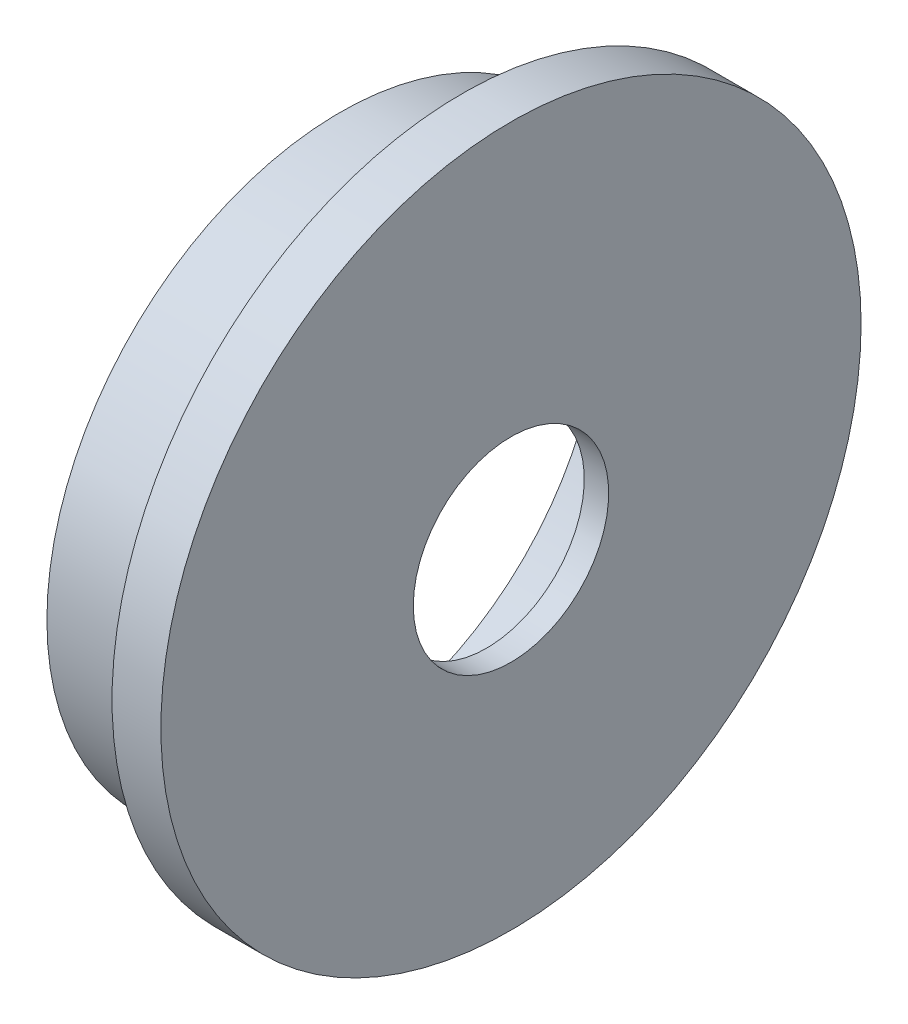
ISO-10303-21;
HEADER;
FILE_DESCRIPTION(('STEP AP214'),'2;1');
FILE_NAME('part.step','',(''),(''),'','','');
FILE_SCHEMA(('AUTOMOTIVE_DESIGN { 1 0 10303 214 1 1 1 1 }'));
ENDSEC;
DATA;
#1=APPLICATION_CONTEXT('core data for automotive mechanical design processes');
#2=APPLICATION_PROTOCOL_DEFINITION('international standard','automotive_design',2000,#1);
#3=PRODUCT_CONTEXT('',#1,'mechanical');
#4=PRODUCT('Part','Part','',(#3));
#5=PRODUCT_RELATED_PRODUCT_CATEGORY('part','',(#4));
#6=PRODUCT_DEFINITION_FORMATION('','',#4);
#7=PRODUCT_DEFINITION_CONTEXT('part definition',#1,'design');
#8=PRODUCT_DEFINITION('design','',#6,#7);
#9=PRODUCT_DEFINITION_SHAPE('','',#8);
#10=(LENGTH_UNIT() NAMED_UNIT(*) SI_UNIT(.MILLI.,.METRE.));
#11=(NAMED_UNIT(*) PLANE_ANGLE_UNIT() SI_UNIT($,.RADIAN.));
#12=(NAMED_UNIT(*) SI_UNIT($,.STERADIAN.) SOLID_ANGLE_UNIT());
#13=UNCERTAINTY_MEASURE_WITH_UNIT(LENGTH_MEASURE(1.E-05),#10,'distance_accuracy_value','');
#14=(GEOMETRIC_REPRESENTATION_CONTEXT(3) GLOBAL_UNCERTAINTY_ASSIGNED_CONTEXT((#13)) GLOBAL_UNIT_ASSIGNED_CONTEXT((#10,
#11,#12)) REPRESENTATION_CONTEXT('',''));
#15=CARTESIAN_POINT('',(0.,0.,0.));
#16=DIRECTION('',(0.,0.,1.));
#17=DIRECTION('',(1.,0.,0.));
#18=AXIS2_PLACEMENT_3D('',#15,#16,#17);
#19=CARTESIAN_POINT('',(-25.9218708534063,0.,0.));
#20=DIRECTION('',(-1.,0.,0.));
#21=DIRECTION('',(0.,0.,1.));
#22=AXIS2_PLACEMENT_3D('',#19,#20,#21);
#23=CYLINDRICAL_SURFACE('',#22,34.);
#24=CARTESIAN_POINT('',(-10.,0.,0.));
#25=DIRECTION('',(-1.,0.,0.));
#26=DIRECTION('',(0.,0.,1.));
#27=AXIS2_PLACEMENT_3D('',#24,#25,#26);
#28=CIRCLE('',#27,34.);
#29=CARTESIAN_POINT('',(-10.,0.,34.));
#30=VERTEX_POINT('',#29);
#31=EDGE_CURVE('E388',#30,#30,#28,.T.);
#32=ORIENTED_EDGE('',*,*,#31,.F.);
#33=EDGE_LOOP('',(#32));
#34=FACE_BOUND('',#33,.T.);
#35=CARTESIAN_POINT('',(-6.,0.,0.));
#36=DIRECTION('',(1.,0.,0.));
#37=DIRECTION('',(0.,0.,-1.));
#38=AXIS2_PLACEMENT_3D('',#35,#36,#37);
#39=CIRCLE('',#38,34.);
#40=CARTESIAN_POINT('',(-6.,0.,-34.));
#41=VERTEX_POINT('',#40);
#42=EDGE_CURVE('E10',#41,#41,#39,.T.);
#43=ORIENTED_EDGE('',*,*,#42,.F.);
#44=EDGE_LOOP('',(#43));
#45=FACE_BOUND('',#44,.T.);
#46=ADVANCED_FACE('F346',(#34,#45),#23,.T.);
#47=CARTESIAN_POINT('',(-25.9218708534063,0.,0.));
#48=DIRECTION('',(-1.,0.,0.));
#49=DIRECTION('',(0.,0.,1.));
#50=AXIS2_PLACEMENT_3D('',#47,#48,#49);
#51=CYLINDRICAL_SURFACE('',#50,28.);
#52=CARTESIAN_POINT('',(-12.,0.,0.));
#53=DIRECTION('',(-1.,0.,0.));
#54=DIRECTION('',(0.,0.,1.));
#55=AXIS2_PLACEMENT_3D('',#52,#53,#54);
#56=CIRCLE('',#55,28.);
#57=CARTESIAN_POINT('',(-12.,0.,28.));
#58=VERTEX_POINT('',#57);
#59=EDGE_CURVE('E373',#58,#58,#56,.T.);
#60=ORIENTED_EDGE('',*,*,#59,.T.);
#61=EDGE_LOOP('',(#60));
#62=FACE_BOUND('',#61,.T.);
#63=CARTESIAN_POINT('',(-6.,0.,0.));
#64=DIRECTION('',(1.,0.,0.));
#65=DIRECTION('',(0.,0.,-1.));
#66=AXIS2_PLACEMENT_3D('',#63,#64,#65);
#67=CIRCLE('',#66,28.);
#68=CARTESIAN_POINT('',(-6.,0.,-28.));
#69=VERTEX_POINT('',#68);
#70=EDGE_CURVE('E354',#69,#69,#67,.F.);
#71=ORIENTED_EDGE('',*,*,#70,.F.);
#72=EDGE_LOOP('',(#71));
#73=FACE_BOUND('',#72,.T.);
#74=ADVANCED_FACE('F430',(#62,#73),#51,.F.);
#75=CARTESIAN_POINT('',(-10.,34.,0.));
#76=DIRECTION('',(-1.,0.,0.));
#77=DIRECTION('',(0.,0.,1.));
#78=AXIS2_PLACEMENT_3D('',#75,#76,#77);
#79=PLANE('',#78);
#80=CARTESIAN_POINT('',(-10.,0.,0.));
#81=DIRECTION('',(-1.,0.,0.));
#82=DIRECTION('',(0.,0.,1.));
#83=AXIS2_PLACEMENT_3D('',#80,#81,#82);
#84=CIRCLE('',#83,36.);
#85=CARTESIAN_POINT('',(-10.,0.,36.));
#86=VERTEX_POINT('',#85);
#87=EDGE_CURVE('E385',#86,#86,#84,.T.);
#88=ORIENTED_EDGE('',*,*,#87,.F.);
#89=EDGE_LOOP('',(#88));
#90=FACE_BOUND('',#89,.T.);
#91=ORIENTED_EDGE('',*,*,#31,.T.);
#92=EDGE_LOOP('',(#91));
#93=FACE_BOUND('',#92,.T.);
#94=ADVANCED_FACE('F436',(#90,#93),#79,.F.);
#95=CARTESIAN_POINT('',(-25.9218708534063,0.,0.));
#96=DIRECTION('',(-1.,0.,0.));
#97=DIRECTION('',(0.,0.,1.));
#98=AXIS2_PLACEMENT_3D('',#95,#96,#97);
#99=CYLINDRICAL_SURFACE('',#98,36.);
#100=CARTESIAN_POINT('',(-21.,0.,0.));
#101=DIRECTION('',(-1.,0.,0.));
#102=DIRECTION('',(0.,0.,1.));
#103=AXIS2_PLACEMENT_3D('',#100,#101,#102);
#104=CIRCLE('',#103,36.);
#105=CARTESIAN_POINT('',(-21.,0.,36.));
#106=VERTEX_POINT('',#105);
#107=EDGE_CURVE('E382',#106,#106,#104,.T.);
#108=ORIENTED_EDGE('',*,*,#107,.F.);
#109=EDGE_LOOP('',(#108));
#110=FACE_BOUND('',#109,.T.);
#111=ORIENTED_EDGE('',*,*,#87,.T.);
#112=EDGE_LOOP('',(#111));
#113=FACE_BOUND('',#112,.T.);
#114=ADVANCED_FACE('F489',(#110,#113),#99,.T.);
#115=CARTESIAN_POINT('',(-21.,36.,0.));
#116=DIRECTION('',(1.,0.,0.));
#117=DIRECTION('',(0.,0.,-1.));
#118=AXIS2_PLACEMENT_3D('',#115,#116,#117);
#119=PLANE('',#118);
#120=CARTESIAN_POINT('',(-21.,0.,0.));
#121=DIRECTION('',(-1.,0.,0.));
#122=DIRECTION('',(0.,0.,1.));
#123=AXIS2_PLACEMENT_3D('',#120,#121,#122);
#124=CIRCLE('',#123,32.);
#125=CARTESIAN_POINT('',(-21.,0.,32.));
#126=VERTEX_POINT('',#125);
#127=EDGE_CURVE('E379',#126,#126,#124,.T.);
#128=ORIENTED_EDGE('',*,*,#127,.F.);
#129=EDGE_LOOP('',(#128));
#130=FACE_BOUND('',#129,.T.);
#131=ORIENTED_EDGE('',*,*,#107,.T.);
#132=EDGE_LOOP('',(#131));
#133=FACE_BOUND('',#132,.T.);
#134=ADVANCED_FACE('F486',(#130,#133),#119,.F.);
#135=CARTESIAN_POINT('',(-25.9218708534063,0.,0.));
#136=DIRECTION('',(-1.,0.,0.));
#137=DIRECTION('',(0.,0.,1.));
#138=AXIS2_PLACEMENT_3D('',#135,#136,#137);
#139=CYLINDRICAL_SURFACE('',#138,32.);
#140=CARTESIAN_POINT('',(-12.,0.,0.));
#141=DIRECTION('',(-1.,0.,0.));
#142=DIRECTION('',(0.,0.,1.));
#143=AXIS2_PLACEMENT_3D('',#140,#141,#142);
#144=CIRCLE('',#143,32.);
#145=CARTESIAN_POINT('',(-12.,0.,32.));
#146=VERTEX_POINT('',#145);
#147=EDGE_CURVE('E376',#146,#146,#144,.T.);
#148=ORIENTED_EDGE('',*,*,#147,.F.);
#149=EDGE_LOOP('',(#148));
#150=FACE_BOUND('',#149,.T.);
#151=ORIENTED_EDGE('',*,*,#127,.T.);
#152=EDGE_LOOP('',(#151));
#153=FACE_BOUND('',#152,.T.);
#154=ADVANCED_FACE('F482',(#150,#153),#139,.F.);
#155=CARTESIAN_POINT('',(-12.,32.,0.));
#156=DIRECTION('',(1.,0.,0.));
#157=DIRECTION('',(0.,0.,-1.));
#158=AXIS2_PLACEMENT_3D('',#155,#156,#157);
#159=PLANE('',#158);
#160=ORIENTED_EDGE('',*,*,#59,.F.);
#161=EDGE_LOOP('',(#160));
#162=FACE_BOUND('',#161,.T.);
#163=ORIENTED_EDGE('',*,*,#147,.T.);
#164=EDGE_LOOP('',(#163));
#165=FACE_BOUND('',#164,.T.);
#166=ADVANCED_FACE('F479',(#162,#165),#159,.F.);
#167=CARTESIAN_POINT('',(-6.,2.5,0.));
#168=DIRECTION('',(1.,0.,0.));
#169=DIRECTION('',(0.,0.,-1.));
#170=AXIS2_PLACEMENT_3D('',#167,#168,#169);
#171=PLANE('',#170);
#172=CARTESIAN_POINT('',(-6.,0.,0.));
#173=DIRECTION('',(1.,0.,0.));
#174=DIRECTION('',(0.,0.,-1.));
#175=AXIS2_PLACEMENT_3D('',#172,#173,#174);
#176=CIRCLE('',#175,25.);
#177=CARTESIAN_POINT('',(-6.,0.,-25.));
#178=VERTEX_POINT('',#177);
#179=EDGE_CURVE('E359',#178,#178,#176,.T.);
#180=ORIENTED_EDGE('',*,*,#179,.T.);
#181=EDGE_LOOP('',(#180));
#182=FACE_BOUND('',#181,.T.);
#183=ORIENTED_EDGE('',*,*,#70,.T.);
#184=EDGE_LOOP('',(#183));
#185=FACE_BOUND('',#184,.T.);
#186=ADVANCED_FACE('F425',(#182,#185),#171,.F.);
#187=CARTESIAN_POINT('',(-6.,2.5,0.));
#188=DIRECTION('',(1.,0.,0.));
#189=DIRECTION('',(0.,0.,-1.));
#190=AXIS2_PLACEMENT_3D('',#187,#188,#189);
#191=CIRCLE('',#190,43.);
#192=CARTESIAN_POINT('',(-6.,2.5,-43.));
#193=VERTEX_POINT('',#192);
#194=EDGE_CURVE('E367',#193,#193,#191,.T.);
#195=ORIENTED_EDGE('',*,*,#194,.F.);
#196=EDGE_LOOP('',(#195));
#197=FACE_BOUND('',#196,.T.);
#198=ORIENTED_EDGE('',*,*,#42,.T.);
#199=EDGE_LOOP('',(#198));
#200=FACE_BOUND('',#199,.T.);
#201=ADVANCED_FACE('F424',(#197,#200),#171,.F.);
#202=CARTESIAN_POINT('',(-6.,2.5,0.));
#203=DIRECTION('',(1.,0.,0.));
#204=DIRECTION('',(0.,0.,-1.));
#205=AXIS2_PLACEMENT_3D('',#202,#203,#204);
#206=CYLINDRICAL_SURFACE('',#205,43.);
#207=ORIENTED_EDGE('',*,*,#194,.T.);
#208=EDGE_LOOP('',(#207));
#209=FACE_BOUND('',#208,.T.);
#210=CARTESIAN_POINT('',(0.,2.5,0.));
#211=DIRECTION('',(1.,0.,0.));
#212=DIRECTION('',(0.,0.,-1.));
#213=AXIS2_PLACEMENT_3D('',#210,#211,#212);
#214=CIRCLE('',#213,43.);
#215=CARTESIAN_POINT('',(0.,2.5,-43.));
#216=VERTEX_POINT('',#215);
#217=EDGE_CURVE('E406',#216,#216,#214,.T.);
#218=ORIENTED_EDGE('',*,*,#217,.F.);
#219=EDGE_LOOP('',(#218));
#220=FACE_BOUND('',#219,.T.);
#221=ADVANCED_FACE('F462',(#209,#220),#206,.T.);
#222=CARTESIAN_POINT('',(-25.9218708534063,0.,0.));
#223=DIRECTION('',(-1.,0.,0.));
#224=DIRECTION('',(0.,0.,1.));
#225=AXIS2_PLACEMENT_3D('',#222,#223,#224);
#226=CYLINDRICAL_SURFACE('',#225,12.);
#227=CARTESIAN_POINT('',(0.,0.,0.));
#228=DIRECTION('',(-1.,0.,0.));
#229=DIRECTION('',(0.,0.,1.));
#230=AXIS2_PLACEMENT_3D('',#227,#228,#229);
#231=CIRCLE('',#230,12.);
#232=CARTESIAN_POINT('',(0.,0.,12.));
#233=VERTEX_POINT('',#232);
#234=EDGE_CURVE('E391',#233,#233,#231,.T.);
#235=ORIENTED_EDGE('',*,*,#234,.F.);
#236=EDGE_LOOP('',(#235));
#237=FACE_BOUND('',#236,.T.);
#238=CARTESIAN_POINT('',(-3.,0.,0.));
#239=DIRECTION('',(-1.,0.,0.));
#240=DIRECTION('',(0.,0.,1.));
#241=AXIS2_PLACEMENT_3D('',#238,#239,#240);
#242=CIRCLE('',#241,12.);
#243=CARTESIAN_POINT('',(-3.,0.,12.));
#244=VERTEX_POINT('',#243);
#245=EDGE_CURVE('E363',#244,#244,#242,.T.);
#246=ORIENTED_EDGE('',*,*,#245,.T.);
#247=EDGE_LOOP('',(#246));
#248=FACE_BOUND('',#247,.T.);
#249=ADVANCED_FACE('F348',(#237,#248),#226,.F.);
#250=CARTESIAN_POINT('',(-3.,18.,0.));
#251=DIRECTION('',(1.,0.,0.));
#252=DIRECTION('',(0.,0.,-1.));
#253=AXIS2_PLACEMENT_3D('',#250,#251,#252);
#254=PLANE('',#253);
#255=ORIENTED_EDGE('',*,*,#245,.F.);
#256=EDGE_LOOP('',(#255));
#257=FACE_BOUND('',#256,.T.);
#258=CARTESIAN_POINT('',(-3.,0.,0.));
#259=DIRECTION('',(1.,0.,0.));
#260=DIRECTION('',(0.,0.,-1.));
#261=AXIS2_PLACEMENT_3D('',#258,#259,#260);
#262=CIRCLE('',#261,17.284931715374);
#263=CARTESIAN_POINT('',(-3.,0.,-17.284931715374));
#264=VERTEX_POINT('',#263);
#265=EDGE_CURVE('E393',#264,#264,#262,.T.);
#266=ORIENTED_EDGE('',*,*,#265,.F.);
#267=EDGE_LOOP('',(#266));
#268=FACE_BOUND('',#267,.T.);
#269=ADVANCED_FACE('F446',(#257,#268),#254,.F.);
#270=CARTESIAN_POINT('',(0.,12.,0.));
#271=DIRECTION('',(-1.,0.,0.));
#272=DIRECTION('',(0.,0.,1.));
#273=AXIS2_PLACEMENT_3D('',#270,#271,#272);
#274=PLANE('',#273);
#275=ORIENTED_EDGE('',*,*,#217,.T.);
#276=EDGE_LOOP('',(#275));
#277=FACE_BOUND('',#276,.T.);
#278=ORIENTED_EDGE('',*,*,#234,.T.);
#279=EDGE_LOOP('',(#278));
#280=FACE_BOUND('',#279,.T.);
#281=ADVANCED_FACE('F443',(#277,#280),#274,.F.);
#282=CARTESIAN_POINT('',(-25.9218708534063,0.,0.));
#283=DIRECTION('',(-1.,0.,0.));
#284=DIRECTION('',(0.,0.,1.));
#285=AXIS2_PLACEMENT_3D('',#282,#283,#284);
#286=CYLINDRICAL_SURFACE('',#285,25.);
#287=CARTESIAN_POINT('',(-10.,0.,0.));
#288=DIRECTION('',(-1.,0.,0.));
#289=DIRECTION('',(0.,0.,1.));
#290=AXIS2_PLACEMENT_3D('',#287,#288,#289);
#291=CIRCLE('',#290,25.);
#292=CARTESIAN_POINT('',(-10.,0.,25.));
#293=VERTEX_POINT('',#292);
#294=EDGE_CURVE('E370',#293,#293,#291,.T.);
#295=ORIENTED_EDGE('',*,*,#294,.F.);
#296=EDGE_LOOP('',(#295));
#297=FACE_BOUND('',#296,.T.);
#298=ORIENTED_EDGE('',*,*,#179,.F.);
#299=EDGE_LOOP('',(#298));
#300=FACE_BOUND('',#299,.T.);
#301=ADVANCED_FACE('F445',(#297,#300),#286,.T.);
#302=CARTESIAN_POINT('',(-10.,25.,0.));
#303=DIRECTION('',(1.,0.,0.));
#304=DIRECTION('',(0.,0.,-1.));
#305=AXIS2_PLACEMENT_3D('',#302,#303,#304);
#306=PLANE('',#305);
#307=CARTESIAN_POINT('',(-10.,0.,0.));
#308=DIRECTION('',(-1.,0.,0.));
#309=DIRECTION('',(0.,0.,1.));
#310=AXIS2_PLACEMENT_3D('',#307,#308,#309);
#311=CIRCLE('',#310,22.);
#312=CARTESIAN_POINT('',(-10.,0.,22.));
#313=VERTEX_POINT('',#312);
#314=EDGE_CURVE('E366',#313,#313,#311,.T.);
#315=ORIENTED_EDGE('',*,*,#314,.F.);
#316=EDGE_LOOP('',(#315));
#317=FACE_BOUND('',#316,.T.);
#318=ORIENTED_EDGE('',*,*,#294,.T.);
#319=EDGE_LOOP('',(#318));
#320=FACE_BOUND('',#319,.T.);
#321=ADVANCED_FACE('F426',(#317,#320),#306,.F.);
#322=CARTESIAN_POINT('',(-25.9218708534063,0.,0.));
#323=DIRECTION('',(-1.,0.,0.));
#324=DIRECTION('',(0.,0.,1.));
#325=AXIS2_PLACEMENT_3D('',#322,#323,#324);
#326=CYLINDRICAL_SURFACE('',#325,22.);
#327=ORIENTED_EDGE('',*,*,#314,.T.);
#328=EDGE_LOOP('',(#327));
#329=FACE_BOUND('',#328,.T.);
#330=CARTESIAN_POINT('',(-6.,0.,0.));
#331=DIRECTION('',(1.,0.,0.));
#332=DIRECTION('',(0.,0.,-1.));
#333=AXIS2_PLACEMENT_3D('',#330,#331,#332);
#334=CIRCLE('',#333,22.);
#335=CARTESIAN_POINT('',(-6.,0.,-22.));
#336=VERTEX_POINT('',#335);
#337=EDGE_CURVE('E350',#336,#336,#334,.F.);
#338=ORIENTED_EDGE('',*,*,#337,.F.);
#339=EDGE_LOOP('',(#338));
#340=FACE_BOUND('',#339,.T.);
#341=ADVANCED_FACE('F417',(#329,#340),#326,.F.);
#342=CARTESIAN_POINT('',(-6.,0.,0.));
#343=DIRECTION('',(1.,0.,0.));
#344=DIRECTION('',(0.,0.,-1.));
#345=AXIS2_PLACEMENT_3D('',#342,#343,#344);
#346=CYLINDRICAL_SURFACE('',#345,17.284931715374);
#347=CARTESIAN_POINT('',(-6.,0.,0.));
#348=DIRECTION('',(1.,0.,0.));
#349=DIRECTION('',(0.,0.,-1.));
#350=AXIS2_PLACEMENT_3D('',#347,#348,#349);
#351=CIRCLE('',#350,17.284931715374);
#352=CARTESIAN_POINT('',(-6.,0.,-17.284931715374));
#353=VERTEX_POINT('',#352);
#354=EDGE_CURVE('E409',#353,#353,#351,.T.);
#355=ORIENTED_EDGE('',*,*,#354,.F.);
#356=EDGE_LOOP('',(#355));
#357=FACE_BOUND('',#356,.T.);
#358=ORIENTED_EDGE('',*,*,#265,.T.);
#359=EDGE_LOOP('',(#358));
#360=FACE_BOUND('',#359,.T.);
#361=ADVANCED_FACE('F415',(#357,#360),#346,.F.);
#362=ORIENTED_EDGE('',*,*,#354,.T.);
#363=EDGE_LOOP('',(#362));
#364=FACE_BOUND('',#363,.T.);
#365=ORIENTED_EDGE('',*,*,#337,.T.);
#366=EDGE_LOOP('',(#365));
#367=FACE_BOUND('',#366,.T.);
#368=ADVANCED_FACE('F413',(#364,#367),#171,.F.);
#369=CLOSED_SHELL('',(#46,#74,#94,#114,#134,#154,#166,#186,#201,#221,#249,#269,#281,#301,#321,
#341,#361,#368));
#370=MANIFOLD_SOLID_BREP('B2',#369);
#371=ADVANCED_BREP_SHAPE_REPRESENTATION('',(#18,#370),#14);
#372=SHAPE_DEFINITION_REPRESENTATION(#9,#371);
ENDSEC;
END-ISO-10303-21;
